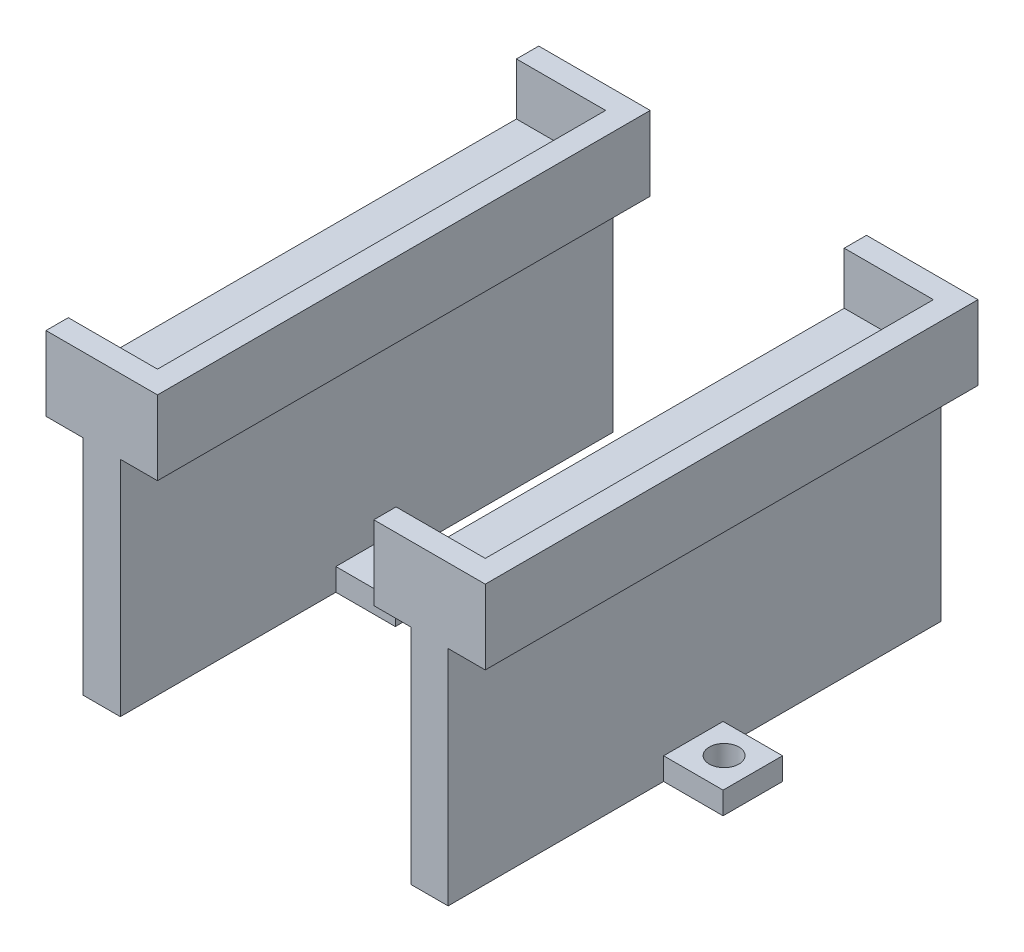
ISO-10303-21;
HEADER;
FILE_DESCRIPTION(('STEP AP214'),'2;1');
FILE_NAME('part.step','',(''),(''),'','','');
FILE_SCHEMA(('AUTOMOTIVE_DESIGN { 1 0 10303 214 1 1 1 1 }'));
ENDSEC;
DATA;
#1=APPLICATION_CONTEXT('core data for automotive mechanical design processes');
#2=APPLICATION_PROTOCOL_DEFINITION('international standard','automotive_design',2000,#1);
#3=PRODUCT_CONTEXT('',#1,'mechanical');
#4=PRODUCT('Part','Part','',(#3));
#5=PRODUCT_RELATED_PRODUCT_CATEGORY('part','',(#4));
#6=PRODUCT_DEFINITION_FORMATION('','',#4);
#7=PRODUCT_DEFINITION_CONTEXT('part definition',#1,'design');
#8=PRODUCT_DEFINITION('design','',#6,#7);
#9=PRODUCT_DEFINITION_SHAPE('','',#8);
#10=(LENGTH_UNIT() NAMED_UNIT(*) SI_UNIT(.MILLI.,.METRE.));
#11=(NAMED_UNIT(*) PLANE_ANGLE_UNIT() SI_UNIT($,.RADIAN.));
#12=(NAMED_UNIT(*) SI_UNIT($,.STERADIAN.) SOLID_ANGLE_UNIT());
#13=UNCERTAINTY_MEASURE_WITH_UNIT(LENGTH_MEASURE(1.E-05),#10,'distance_accuracy_value','');
#14=(GEOMETRIC_REPRESENTATION_CONTEXT(3) GLOBAL_UNCERTAINTY_ASSIGNED_CONTEXT((#13)) GLOBAL_UNIT_ASSIGNED_CONTEXT((#10,
#11,#12)) REPRESENTATION_CONTEXT('',''));
#15=CARTESIAN_POINT('',(0.,0.,0.));
#16=DIRECTION('',(0.,0.,1.));
#17=DIRECTION('',(1.,0.,0.));
#18=AXIS2_PLACEMENT_3D('',#15,#16,#17);
#19=CARTESIAN_POINT('',(98.107994905193,-30.,39.1134711117816));
#20=DIRECTION('',(1.,0.,0.));
#21=DIRECTION('',(0.,0.,-1.));
#22=AXIS2_PLACEMENT_3D('',#19,#20,#21);
#23=PLANE('',#22);
#24=DIRECTION('',(0.,0.,-1.));
#25=VECTOR('',#24,1.);
#26=CARTESIAN_POINT('',(98.107994905193,0.,39.1134711117816));
#27=LINE('',#26,#25);
#28=CARTESIAN_POINT('',(98.107994905193,0.,39.1134711117816));
#29=VERTEX_POINT('',#28);
#30=CARTESIAN_POINT('',(98.107994905193,0.,-27.1865288882184));
#31=VERTEX_POINT('',#30);
#32=EDGE_CURVE('E224',#29,#31,#27,.T.);
#33=ORIENTED_EDGE('',*,*,#32,.T.);
#34=DIRECTION('',(0.,1.,0.));
#35=VECTOR('',#34,1.);
#36=CARTESIAN_POINT('',(98.107994905193,-30.,-27.1865288882184));
#37=LINE('',#36,#35);
#38=CARTESIAN_POINT('',(98.107994905193,-30.,-27.1865288882184));
#39=VERTEX_POINT('',#38);
#40=EDGE_CURVE('E219',#39,#31,#37,.T.);
#41=ORIENTED_EDGE('',*,*,#40,.F.);
#42=DIRECTION('',(0.,0.,-1.));
#43=VECTOR('',#42,1.);
#44=CARTESIAN_POINT('',(98.107994905193,-30.,39.1134711117816));
#45=LINE('',#44,#43);
#46=CARTESIAN_POINT('',(98.107994905193,-30.,39.1134711117816));
#47=VERTEX_POINT('',#46);
#48=EDGE_CURVE('E233',#47,#39,#45,.T.);
#49=ORIENTED_EDGE('',*,*,#48,.F.);
#50=DIRECTION('',(0.,1.,0.));
#51=VECTOR('',#50,1.);
#52=CARTESIAN_POINT('',(98.107994905193,-30.,39.1134711117816));
#53=LINE('',#52,#51);
#54=EDGE_CURVE('E216',#47,#29,#53,.T.);
#55=ORIENTED_EDGE('',*,*,#54,.T.);
#56=EDGE_LOOP('',(#33,#41,#49,#55));
#57=FACE_BOUND('',#56,.T.);
#58=ADVANCED_FACE('F48',(#57),#23,.F.);
#59=CARTESIAN_POINT('',(44.104133085914,-30.,0.));
#60=DIRECTION('',(0.,-1.,0.));
#61=DIRECTION('',(0.,0.,-1.));
#62=AXIS2_PLACEMENT_3D('',#59,#60,#61);
#63=PLANE('',#62);
#64=DIRECTION('',(0.,0.,1.));
#65=VECTOR('',#64,1.);
#66=CARTESIAN_POINT('',(103.107994905193,-30.,39.1134711117816));
#67=LINE('',#66,#65);
#68=CARTESIAN_POINT('',(103.107994905193,-30.,-27.1865288882184));
#69=VERTEX_POINT('',#68);
#70=CARTESIAN_POINT('',(103.107994905193,-30.,2.11347111178159));
#71=VERTEX_POINT('',#70);
#72=EDGE_CURVE('E228',#69,#71,#67,.T.);
#73=ORIENTED_EDGE('',*,*,#72,.T.);
#74=DIRECTION('',(1.,0.,0.));
#75=VECTOR('',#74,1.);
#76=CARTESIAN_POINT('',(111.107994905193,-30.,2.11347111178159));
#77=LINE('',#76,#75);
#78=CARTESIAN_POINT('',(111.107994905193,-30.,2.11347111178159));
#79=VERTEX_POINT('',#78);
#80=EDGE_CURVE('E176',#71,#79,#77,.T.);
#81=ORIENTED_EDGE('',*,*,#80,.T.);
#82=DIRECTION('',(0.,0.,1.));
#83=VECTOR('',#82,1.);
#84=CARTESIAN_POINT('',(111.107994905193,-30.,2.11347111178159));
#85=LINE('',#84,#83);
#86=CARTESIAN_POINT('',(111.107994905193,-30.,10.1134711117816));
#87=VERTEX_POINT('',#86);
#88=EDGE_CURVE('E163',#79,#87,#85,.T.);
#89=ORIENTED_EDGE('',*,*,#88,.T.);
#90=DIRECTION('',(-1.,0.,0.));
#91=VECTOR('',#90,1.);
#92=CARTESIAN_POINT('',(111.107994905193,-30.,10.1134711117816));
#93=LINE('',#92,#91);
#94=CARTESIAN_POINT('',(103.107994905193,-30.,10.1134711117816));
#95=VERTEX_POINT('',#94);
#96=EDGE_CURVE('E63',#87,#95,#93,.T.);
#97=ORIENTED_EDGE('',*,*,#96,.T.);
#98=CARTESIAN_POINT('',(103.107994905193,-30.,39.1134711117816));
#99=VERTEX_POINT('',#98);
#100=EDGE_CURVE('E237',#95,#99,#67,.T.);
#101=ORIENTED_EDGE('',*,*,#100,.T.);
#102=DIRECTION('',(-1.,0.,0.));
#103=VECTOR('',#102,1.);
#104=CARTESIAN_POINT('',(98.107994905193,-30.,39.1134711117816));
#105=LINE('',#104,#103);
#106=EDGE_CURVE('E235',#99,#47,#105,.T.);
#107=ORIENTED_EDGE('',*,*,#106,.T.);
#108=ORIENTED_EDGE('',*,*,#48,.T.);
#109=DIRECTION('',(1.,0.,0.));
#110=VECTOR('',#109,1.);
#111=CARTESIAN_POINT('',(98.107994905193,-30.,-27.1865288882184));
#112=LINE('',#111,#110);
#113=EDGE_CURVE('E223',#39,#69,#112,.T.);
#114=ORIENTED_EDGE('',*,*,#113,.T.);
#115=EDGE_LOOP('',(#73,#81,#89,#97,#101,#107,#108,#114));
#116=FACE_BOUND('',#115,.T.);
#117=CARTESIAN_POINT('',(107.150165762411,-30.,6.02116583114644));
#118=DIRECTION('',(0.,-1.,0.));
#119=DIRECTION('',(0.,0.,-1.));
#120=AXIS2_PLACEMENT_3D('',#117,#118,#119);
#121=CIRCLE('',#120,1.99416254043105);
#122=CARTESIAN_POINT('',(107.150165762411,-30.,4.02700329071538));
#123=VERTEX_POINT('',#122);
#124=EDGE_CURVE('E196',#123,#123,#121,.T.);
#125=ORIENTED_EDGE('',*,*,#124,.F.);
#126=EDGE_LOOP('',(#125));
#127=FACE_BOUND('',#126,.T.);
#128=ADVANCED_FACE('F174',(#116,#127),#63,.T.);
#129=CARTESIAN_POINT('',(103.107994905193,-30.,39.1134711117816));
#130=DIRECTION('',(-1.,0.,0.));
#131=DIRECTION('',(0.,0.,1.));
#132=AXIS2_PLACEMENT_3D('',#129,#130,#131);
#133=PLANE('',#132);
#134=ORIENTED_EDGE('',*,*,#100,.F.);
#135=DIRECTION('',(0.,-1.,0.));
#136=VECTOR('',#135,1.);
#137=CARTESIAN_POINT('',(103.107994905193,-27.,10.1134711117816));
#138=LINE('',#137,#136);
#139=CARTESIAN_POINT('',(103.107994905193,-27.,10.1134711117816));
#140=VERTEX_POINT('',#139);
#141=EDGE_CURVE('E171',#140,#95,#138,.T.);
#142=ORIENTED_EDGE('',*,*,#141,.F.);
#143=DIRECTION('',(0.,0.,-1.));
#144=VECTOR('',#143,1.);
#145=CARTESIAN_POINT('',(103.107994905193,-27.,2.11347111178159));
#146=LINE('',#145,#144);
#147=CARTESIAN_POINT('',(103.107994905193,-27.,2.11347111178159));
#148=VERTEX_POINT('',#147);
#149=EDGE_CURVE('E181',#140,#148,#146,.T.);
#150=ORIENTED_EDGE('',*,*,#149,.T.);
#151=DIRECTION('',(0.,-1.,0.));
#152=VECTOR('',#151,1.);
#153=CARTESIAN_POINT('',(103.107994905193,-27.,2.11347111178159));
#154=LINE('',#153,#152);
#155=EDGE_CURVE('E192',#148,#71,#154,.T.);
#156=ORIENTED_EDGE('',*,*,#155,.T.);
#157=ORIENTED_EDGE('',*,*,#72,.F.);
#158=DIRECTION('',(0.,1.,0.));
#159=VECTOR('',#158,1.);
#160=CARTESIAN_POINT('',(103.107994905193,-30.,-27.1865288882184));
#161=LINE('',#160,#159);
#162=CARTESIAN_POINT('',(103.107994905193,0.,-27.1865288882184));
#163=VERTEX_POINT('',#162);
#164=EDGE_CURVE('E221',#69,#163,#161,.T.);
#165=ORIENTED_EDGE('',*,*,#164,.T.);
#166=DIRECTION('',(0.,0.,1.));
#167=VECTOR('',#166,1.);
#168=CARTESIAN_POINT('',(103.107994905193,0.,39.1134711117816));
#169=LINE('',#168,#167);
#170=CARTESIAN_POINT('',(103.107994905193,0.,39.1134711117816));
#171=VERTEX_POINT('',#170);
#172=EDGE_CURVE('E227',#163,#171,#169,.T.);
#173=ORIENTED_EDGE('',*,*,#172,.T.);
#174=DIRECTION('',(0.,1.,0.));
#175=VECTOR('',#174,1.);
#176=CARTESIAN_POINT('',(103.107994905193,-30.,39.1134711117816));
#177=LINE('',#176,#175);
#178=EDGE_CURVE('E214',#99,#171,#177,.T.);
#179=ORIENTED_EDGE('',*,*,#178,.F.);
#180=EDGE_LOOP('',(#134,#142,#150,#156,#157,#165,#173,#179));
#181=FACE_BOUND('',#180,.T.);
#182=ADVANCED_FACE('F324',(#181),#133,.F.);
#183=CARTESIAN_POINT('',(44.104133085914,0.,0.));
#184=DIRECTION('',(0.,1.,0.));
#185=DIRECTION('',(0.,0.,1.));
#186=AXIS2_PLACEMENT_3D('',#183,#184,#185);
#187=PLANE('',#186);
#188=ORIENTED_EDGE('',*,*,#172,.F.);
#189=DIRECTION('',(-1.,0.,0.));
#190=VECTOR('',#189,1.);
#191=CARTESIAN_POINT('',(108.107994905193,0.,-27.1865288882184));
#192=LINE('',#191,#190);
#193=CARTESIAN_POINT('',(108.107994905193,0.,-27.1865288882184));
#194=VERTEX_POINT('',#193);
#195=EDGE_CURVE('E255',#194,#163,#192,.T.);
#196=ORIENTED_EDGE('',*,*,#195,.F.);
#197=DIRECTION('',(0.,0.,-1.));
#198=VECTOR('',#197,1.);
#199=CARTESIAN_POINT('',(108.107994905193,0.,39.1134711117816));
#200=LINE('',#199,#198);
#201=CARTESIAN_POINT('',(108.107994905193,0.,39.1134711117816));
#202=VERTEX_POINT('',#201);
#203=EDGE_CURVE('E263',#202,#194,#200,.T.);
#204=ORIENTED_EDGE('',*,*,#203,.F.);
#205=DIRECTION('',(1.,0.,0.));
#206=VECTOR('',#205,1.);
#207=CARTESIAN_POINT('',(108.107994905193,0.,39.1134711117816));
#208=LINE('',#207,#206);
#209=EDGE_CURVE('E251',#171,#202,#208,.T.);
#210=ORIENTED_EDGE('',*,*,#209,.F.);
#211=EDGE_LOOP('',(#188,#196,#204,#210));
#212=FACE_BOUND('',#211,.T.);
#213=ADVANCED_FACE('F330',(#212),#187,.F.);
#214=CARTESIAN_POINT('',(108.107994905193,10.,39.1134711117816));
#215=DIRECTION('',(-1.,0.,0.));
#216=DIRECTION('',(0.,0.,1.));
#217=AXIS2_PLACEMENT_3D('',#214,#215,#216);
#218=PLANE('',#217);
#219=ORIENTED_EDGE('',*,*,#203,.T.);
#220=DIRECTION('',(0.,-1.,0.));
#221=VECTOR('',#220,1.);
#222=CARTESIAN_POINT('',(108.107994905193,10.,-27.1865288882184));
#223=LINE('',#222,#221);
#224=CARTESIAN_POINT('',(108.107994905193,10.,-27.1865288882184));
#225=VERTEX_POINT('',#224);
#226=EDGE_CURVE('E260',#225,#194,#223,.T.);
#227=ORIENTED_EDGE('',*,*,#226,.F.);
#228=DIRECTION('',(0.,0.,-1.));
#229=VECTOR('',#228,1.);
#230=CARTESIAN_POINT('',(108.107994905193,10.,39.1134711117816));
#231=LINE('',#230,#229);
#232=CARTESIAN_POINT('',(108.107994905193,10.,39.1134711117816));
#233=VERTEX_POINT('',#232);
#234=EDGE_CURVE('E254',#233,#225,#231,.T.);
#235=ORIENTED_EDGE('',*,*,#234,.F.);
#236=DIRECTION('',(0.,-1.,0.));
#237=VECTOR('',#236,1.);
#238=CARTESIAN_POINT('',(108.107994905193,10.,39.1134711117816));
#239=LINE('',#238,#237);
#240=EDGE_CURVE('E270',#233,#202,#239,.T.);
#241=ORIENTED_EDGE('',*,*,#240,.T.);
#242=EDGE_LOOP('',(#219,#227,#235,#241));
#243=FACE_BOUND('',#242,.T.);
#244=ADVANCED_FACE('F333',(#243),#218,.F.);
#245=CARTESIAN_POINT('',(105.107994905193,10.000012,36.1134711117816));
#246=DIRECTION('',(-1.,0.,0.));
#247=DIRECTION('',(0.,0.,1.));
#248=AXIS2_PLACEMENT_3D('',#245,#246,#247);
#249=PLANE('',#248);
#250=DIRECTION('',(0.,-1.,0.));
#251=VECTOR('',#250,1.);
#252=CARTESIAN_POINT('',(105.107994905193,10.000012,-24.1865288882183));
#253=LINE('',#252,#251);
#254=CARTESIAN_POINT('',(105.107994905193,10.,-24.1865288882183));
#255=VERTEX_POINT('',#254);
#256=CARTESIAN_POINT('',(105.107994905193,3.,-24.1865288882183));
#257=VERTEX_POINT('',#256);
#258=EDGE_CURVE('E246',#255,#257,#253,.T.);
#259=ORIENTED_EDGE('',*,*,#258,.T.);
#260=DIRECTION('',(0.,0.,-1.));
#261=VECTOR('',#260,1.);
#262=CARTESIAN_POINT('',(105.107994905193,3.,36.1134711117816));
#263=LINE('',#262,#261);
#264=CARTESIAN_POINT('',(105.107994905193,3.,36.1134711117816));
#265=VERTEX_POINT('',#264);
#266=EDGE_CURVE('E240',#265,#257,#263,.T.);
#267=ORIENTED_EDGE('',*,*,#266,.F.);
#268=DIRECTION('',(0.,-1.,0.));
#269=VECTOR('',#268,1.);
#270=CARTESIAN_POINT('',(105.107994905193,10.000012,36.1134711117816));
#271=LINE('',#270,#269);
#272=CARTESIAN_POINT('',(105.107994905193,10.,36.1134711117816));
#273=VERTEX_POINT('',#272);
#274=EDGE_CURVE('E248',#273,#265,#271,.T.);
#275=ORIENTED_EDGE('',*,*,#274,.F.);
#276=DIRECTION('',(0.,0.,1.));
#277=VECTOR('',#276,1.);
#278=CARTESIAN_POINT('',(105.107994905193,10.,0.));
#279=LINE('',#278,#277);
#280=EDGE_CURVE('E275',#255,#273,#279,.T.);
#281=ORIENTED_EDGE('',*,*,#280,.F.);
#282=EDGE_LOOP('',(#259,#267,#275,#281));
#283=FACE_BOUND('',#282,.T.);
#284=ADVANCED_FACE('F289',(#283),#249,.T.);
#285=CARTESIAN_POINT('',(44.104133085914,3.,0.));
#286=DIRECTION('',(0.,1.,0.));
#287=DIRECTION('',(0.,0.,1.));
#288=AXIS2_PLACEMENT_3D('',#285,#286,#287);
#289=PLANE('',#288);
#290=DIRECTION('',(0.,0.,-1.));
#291=VECTOR('',#290,1.);
#292=CARTESIAN_POINT('',(93.107994905193,3.,0.));
#293=LINE('',#292,#291);
#294=CARTESIAN_POINT('',(93.107994905193,3.,36.1134711117816));
#295=VERTEX_POINT('',#294);
#296=CARTESIAN_POINT('',(93.107994905193,3.,-24.1865288882183));
#297=VERTEX_POINT('',#296);
#298=EDGE_CURVE('E12',#295,#297,#293,.T.);
#299=ORIENTED_EDGE('',*,*,#298,.F.);
#300=DIRECTION('',(1.,0.,0.));
#301=VECTOR('',#300,1.);
#302=CARTESIAN_POINT('',(105.107994905193,3.,36.1134711117816));
#303=LINE('',#302,#301);
#304=EDGE_CURVE('E231',#295,#265,#303,.T.);
#305=ORIENTED_EDGE('',*,*,#304,.T.);
#306=ORIENTED_EDGE('',*,*,#266,.T.);
#307=DIRECTION('',(-1.,0.,0.));
#308=VECTOR('',#307,1.);
#309=CARTESIAN_POINT('',(105.107994905193,3.,-24.1865288882183));
#310=LINE('',#309,#308);
#311=EDGE_CURVE('E243',#257,#297,#310,.T.);
#312=ORIENTED_EDGE('',*,*,#311,.T.);
#313=EDGE_LOOP('',(#299,#305,#306,#312));
#314=FACE_BOUND('',#313,.T.);
#315=ADVANCED_FACE('F293',(#314),#289,.T.);
#316=CARTESIAN_POINT('',(105.107994905193,10.000012,-24.1865288882183));
#317=DIRECTION('',(0.,0.,1.));
#318=DIRECTION('',(1.,0.,0.));
#319=AXIS2_PLACEMENT_3D('',#316,#317,#318);
#320=PLANE('',#319);
#321=DIRECTION('',(0.,1.,0.));
#322=VECTOR('',#321,1.);
#323=CARTESIAN_POINT('',(93.107994905193,10.000012,-24.1865288882183));
#324=LINE('',#323,#322);
#325=CARTESIAN_POINT('',(93.107994905193,10.,-24.1865288882183));
#326=VERTEX_POINT('',#325);
#327=EDGE_CURVE('E207',#297,#326,#324,.T.);
#328=ORIENTED_EDGE('',*,*,#327,.F.);
#329=ORIENTED_EDGE('',*,*,#311,.F.);
#330=ORIENTED_EDGE('',*,*,#258,.F.);
#331=DIRECTION('',(1.,0.,0.));
#332=VECTOR('',#331,1.);
#333=CARTESIAN_POINT('',(44.104133085914,10.,-24.1865288882183));
#334=LINE('',#333,#332);
#335=EDGE_CURVE('E273',#326,#255,#334,.T.);
#336=ORIENTED_EDGE('',*,*,#335,.F.);
#337=EDGE_LOOP('',(#328,#329,#330,#336));
#338=FACE_BOUND('',#337,.T.);
#339=ADVANCED_FACE('F296',(#338),#320,.T.);
#340=CARTESIAN_POINT('',(105.107994905193,10.000012,36.1134711117816));
#341=DIRECTION('',(0.,0.,-1.));
#342=DIRECTION('',(-1.,0.,0.));
#343=AXIS2_PLACEMENT_3D('',#340,#341,#342);
#344=PLANE('',#343);
#345=DIRECTION('',(0.,-1.,0.));
#346=VECTOR('',#345,1.);
#347=CARTESIAN_POINT('',(93.107994905193,10.000012,36.1134711117816));
#348=LINE('',#347,#346);
#349=CARTESIAN_POINT('',(93.107994905193,10.,36.1134711117816));
#350=VERTEX_POINT('',#349);
#351=EDGE_CURVE('E70',#350,#295,#348,.T.);
#352=ORIENTED_EDGE('',*,*,#351,.F.);
#353=DIRECTION('',(-1.,0.,0.));
#354=VECTOR('',#353,1.);
#355=CARTESIAN_POINT('',(44.104133085914,10.,36.1134711117816));
#356=LINE('',#355,#354);
#357=EDGE_CURVE('E56',#273,#350,#356,.T.);
#358=ORIENTED_EDGE('',*,*,#357,.F.);
#359=ORIENTED_EDGE('',*,*,#274,.T.);
#360=ORIENTED_EDGE('',*,*,#304,.F.);
#361=EDGE_LOOP('',(#352,#358,#359,#360));
#362=FACE_BOUND('',#361,.T.);
#363=ADVANCED_FACE('F285',(#362),#344,.T.);
#364=CARTESIAN_POINT('',(108.107994905193,10.,-27.1865288882184));
#365=DIRECTION('',(0.,0.,1.));
#366=DIRECTION('',(1.,0.,0.));
#367=AXIS2_PLACEMENT_3D('',#364,#365,#366);
#368=PLANE('',#367);
#369=CARTESIAN_POINT('',(93.107994905193,0.,-27.1865288882184));
#370=VERTEX_POINT('',#369);
#371=EDGE_CURVE('E265',#31,#370,#192,.T.);
#372=ORIENTED_EDGE('',*,*,#371,.T.);
#373=DIRECTION('',(0.,-1.,0.));
#374=VECTOR('',#373,1.);
#375=CARTESIAN_POINT('',(93.107994905193,30.,-27.1865288882184));
#376=LINE('',#375,#374);
#377=CARTESIAN_POINT('',(93.107994905193,10.,-27.1865288882184));
#378=VERTEX_POINT('',#377);
#379=EDGE_CURVE('E203',#378,#370,#376,.T.);
#380=ORIENTED_EDGE('',*,*,#379,.F.);
#381=DIRECTION('',(-1.,0.,0.));
#382=VECTOR('',#381,1.);
#383=CARTESIAN_POINT('',(108.107994905193,10.,-27.1865288882184));
#384=LINE('',#383,#382);
#385=EDGE_CURVE('E257',#225,#378,#384,.T.);
#386=ORIENTED_EDGE('',*,*,#385,.F.);
#387=ORIENTED_EDGE('',*,*,#226,.T.);
#388=ORIENTED_EDGE('',*,*,#195,.T.);
#389=ORIENTED_EDGE('',*,*,#164,.F.);
#390=ORIENTED_EDGE('',*,*,#113,.F.);
#391=ORIENTED_EDGE('',*,*,#40,.T.);
#392=EDGE_LOOP('',(#372,#380,#386,#387,#388,#389,#390,#391));
#393=FACE_BOUND('',#392,.T.);
#394=ADVANCED_FACE('F306',(#393),#368,.F.);
#395=CARTESIAN_POINT('',(108.107994905193,10.,39.1134711117816));
#396=DIRECTION('',(0.,0.,-1.));
#397=DIRECTION('',(-1.,0.,0.));
#398=AXIS2_PLACEMENT_3D('',#395,#396,#397);
#399=PLANE('',#398);
#400=DIRECTION('',(1.,0.,0.));
#401=VECTOR('',#400,1.);
#402=CARTESIAN_POINT('',(108.107994905193,10.,39.1134711117816));
#403=LINE('',#402,#401);
#404=CARTESIAN_POINT('',(93.107994905193,10.,39.1134711117816));
#405=VERTEX_POINT('',#404);
#406=EDGE_CURVE('E252',#405,#233,#403,.T.);
#407=ORIENTED_EDGE('',*,*,#406,.F.);
#408=DIRECTION('',(0.,-1.,0.));
#409=VECTOR('',#408,1.);
#410=CARTESIAN_POINT('',(93.107994905193,30.,39.1134711117816));
#411=LINE('',#410,#409);
#412=CARTESIAN_POINT('',(93.107994905193,0.,39.1134711117816));
#413=VERTEX_POINT('',#412);
#414=EDGE_CURVE('E204',#405,#413,#411,.T.);
#415=ORIENTED_EDGE('',*,*,#414,.T.);
#416=EDGE_CURVE('E261',#413,#29,#208,.T.);
#417=ORIENTED_EDGE('',*,*,#416,.T.);
#418=ORIENTED_EDGE('',*,*,#54,.F.);
#419=ORIENTED_EDGE('',*,*,#106,.F.);
#420=ORIENTED_EDGE('',*,*,#178,.T.);
#421=ORIENTED_EDGE('',*,*,#209,.T.);
#422=ORIENTED_EDGE('',*,*,#240,.F.);
#423=EDGE_LOOP('',(#407,#415,#417,#418,#419,#420,#421,#422));
#424=FACE_BOUND('',#423,.T.);
#425=ADVANCED_FACE('F50',(#424),#399,.F.);
#426=CARTESIAN_POINT('',(44.104133085914,10.,0.));
#427=DIRECTION('',(0.,1.,0.));
#428=DIRECTION('',(0.,0.,1.));
#429=AXIS2_PLACEMENT_3D('',#426,#427,#428);
#430=PLANE('',#429);
#431=DIRECTION('',(0.,0.,-1.));
#432=VECTOR('',#431,1.);
#433=CARTESIAN_POINT('',(93.107994905193,10.,0.));
#434=LINE('',#433,#432);
#435=EDGE_CURVE('E213',#405,#350,#434,.T.);
#436=ORIENTED_EDGE('',*,*,#435,.F.);
#437=ORIENTED_EDGE('',*,*,#406,.T.);
#438=ORIENTED_EDGE('',*,*,#234,.T.);
#439=ORIENTED_EDGE('',*,*,#385,.T.);
#440=EDGE_CURVE('E211',#326,#378,#434,.T.);
#441=ORIENTED_EDGE('',*,*,#440,.F.);
#442=ORIENTED_EDGE('',*,*,#335,.T.);
#443=ORIENTED_EDGE('',*,*,#280,.T.);
#444=ORIENTED_EDGE('',*,*,#357,.T.);
#445=EDGE_LOOP('',(#436,#437,#438,#439,#441,#442,#443,#444));
#446=FACE_BOUND('',#445,.T.);
#447=ADVANCED_FACE('F280',(#446),#430,.T.);
#448=ORIENTED_EDGE('',*,*,#416,.F.);
#449=DIRECTION('',(0.,0.,1.));
#450=VECTOR('',#449,1.);
#451=CARTESIAN_POINT('',(93.107994905193,0.,-27.1865288882184));
#452=LINE('',#451,#450);
#453=EDGE_CURVE('E199',#370,#413,#452,.T.);
#454=ORIENTED_EDGE('',*,*,#453,.F.);
#455=ORIENTED_EDGE('',*,*,#371,.F.);
#456=ORIENTED_EDGE('',*,*,#32,.F.);
#457=EDGE_LOOP('',(#448,#454,#455,#456));
#458=FACE_BOUND('',#457,.T.);
#459=ADVANCED_FACE('F312',(#458),#187,.F.);
#460=CARTESIAN_POINT('',(93.107994905193,30.,-27.1865288882184));
#461=DIRECTION('',(1.,0.,0.));
#462=DIRECTION('',(0.,0.,-1.));
#463=AXIS2_PLACEMENT_3D('',#460,#461,#462);
#464=PLANE('',#463);
#465=ORIENTED_EDGE('',*,*,#435,.T.);
#466=ORIENTED_EDGE('',*,*,#351,.T.);
#467=ORIENTED_EDGE('',*,*,#298,.T.);
#468=ORIENTED_EDGE('',*,*,#327,.T.);
#469=ORIENTED_EDGE('',*,*,#440,.T.);
#470=ORIENTED_EDGE('',*,*,#379,.T.);
#471=ORIENTED_EDGE('',*,*,#453,.T.);
#472=ORIENTED_EDGE('',*,*,#414,.F.);
#473=EDGE_LOOP('',(#465,#466,#467,#468,#469,#470,#471,#472));
#474=FACE_BOUND('',#473,.T.);
#475=ADVANCED_FACE('F299',(#474),#464,.F.);
#476=CARTESIAN_POINT('',(111.107994905193,-27.,10.1134711117816));
#477=DIRECTION('',(0.,0.,1.));
#478=DIRECTION('',(1.,0.,0.));
#479=AXIS2_PLACEMENT_3D('',#476,#477,#478);
#480=PLANE('',#479);
#481=ORIENTED_EDGE('',*,*,#96,.F.);
#482=DIRECTION('',(0.,-1.,0.));
#483=VECTOR('',#482,1.);
#484=CARTESIAN_POINT('',(111.107994905193,-27.,10.1134711117816));
#485=LINE('',#484,#483);
#486=CARTESIAN_POINT('',(111.107994905193,-27.,10.1134711117816));
#487=VERTEX_POINT('',#486);
#488=EDGE_CURVE('E161',#487,#87,#485,.T.);
#489=ORIENTED_EDGE('',*,*,#488,.F.);
#490=DIRECTION('',(-1.,0.,0.));
#491=VECTOR('',#490,1.);
#492=CARTESIAN_POINT('',(111.107994905193,-27.,10.1134711117816));
#493=LINE('',#492,#491);
#494=EDGE_CURVE('E190',#487,#140,#493,.T.);
#495=ORIENTED_EDGE('',*,*,#494,.T.);
#496=ORIENTED_EDGE('',*,*,#141,.T.);
#497=EDGE_LOOP('',(#481,#489,#495,#496));
#498=FACE_BOUND('',#497,.T.);
#499=ADVANCED_FACE('F178',(#498),#480,.T.);
#500=CARTESIAN_POINT('',(111.107994905193,-27.,2.11347111178159));
#501=DIRECTION('',(1.,0.,0.));
#502=DIRECTION('',(0.,0.,-1.));
#503=AXIS2_PLACEMENT_3D('',#500,#501,#502);
#504=PLANE('',#503);
#505=ORIENTED_EDGE('',*,*,#88,.F.);
#506=DIRECTION('',(0.,-1.,0.));
#507=VECTOR('',#506,1.);
#508=CARTESIAN_POINT('',(111.107994905193,-27.,2.11347111178159));
#509=LINE('',#508,#507);
#510=CARTESIAN_POINT('',(111.107994905193,-27.,2.11347111178159));
#511=VERTEX_POINT('',#510);
#512=EDGE_CURVE('E170',#511,#79,#509,.T.);
#513=ORIENTED_EDGE('',*,*,#512,.F.);
#514=DIRECTION('',(0.,0.,1.));
#515=VECTOR('',#514,1.);
#516=CARTESIAN_POINT('',(111.107994905193,-27.,2.11347111178159));
#517=LINE('',#516,#515);
#518=EDGE_CURVE('E166',#511,#487,#517,.T.);
#519=ORIENTED_EDGE('',*,*,#518,.T.);
#520=ORIENTED_EDGE('',*,*,#488,.T.);
#521=EDGE_LOOP('',(#505,#513,#519,#520));
#522=FACE_BOUND('',#521,.T.);
#523=ADVANCED_FACE('F162',(#522),#504,.T.);
#524=CARTESIAN_POINT('',(111.107994905193,-27.,2.11347111178159));
#525=DIRECTION('',(0.,0.,-1.));
#526=DIRECTION('',(-1.,0.,0.));
#527=AXIS2_PLACEMENT_3D('',#524,#525,#526);
#528=PLANE('',#527);
#529=ORIENTED_EDGE('',*,*,#80,.F.);
#530=ORIENTED_EDGE('',*,*,#155,.F.);
#531=DIRECTION('',(1.,0.,0.));
#532=VECTOR('',#531,1.);
#533=CARTESIAN_POINT('',(111.107994905193,-27.,2.11347111178159));
#534=LINE('',#533,#532);
#535=EDGE_CURVE('E184',#148,#511,#534,.T.);
#536=ORIENTED_EDGE('',*,*,#535,.T.);
#537=ORIENTED_EDGE('',*,*,#512,.T.);
#538=EDGE_LOOP('',(#529,#530,#536,#537));
#539=FACE_BOUND('',#538,.T.);
#540=ADVANCED_FACE('F395',(#539),#528,.T.);
#541=CARTESIAN_POINT('',(44.104133085914,-27.,0.));
#542=DIRECTION('',(0.,-1.,0.));
#543=DIRECTION('',(0.,0.,-1.));
#544=AXIS2_PLACEMENT_3D('',#541,#542,#543);
#545=PLANE('',#544);
#546=CARTESIAN_POINT('',(107.150165762411,-27.,6.02116583114644));
#547=DIRECTION('',(0.,-1.,0.));
#548=DIRECTION('',(0.,0.,-1.));
#549=AXIS2_PLACEMENT_3D('',#546,#547,#548);
#550=CIRCLE('',#549,1.99416254043105);
#551=CARTESIAN_POINT('',(107.150165762411,-27.,4.02700329071538));
#552=VERTEX_POINT('',#551);
#553=EDGE_CURVE('E189',#552,#552,#550,.T.);
#554=ORIENTED_EDGE('',*,*,#553,.T.);
#555=EDGE_LOOP('',(#554));
#556=FACE_BOUND('',#555,.T.);
#557=ORIENTED_EDGE('',*,*,#149,.F.);
#558=ORIENTED_EDGE('',*,*,#494,.F.);
#559=ORIENTED_EDGE('',*,*,#518,.F.);
#560=ORIENTED_EDGE('',*,*,#535,.F.);
#561=EDGE_LOOP('',(#557,#558,#559,#560));
#562=FACE_BOUND('',#561,.T.);
#563=ADVANCED_FACE('F403',(#556,#562),#545,.F.);
#564=CARTESIAN_POINT('',(107.150165762411,-27.,6.02116583114644));
#565=DIRECTION('',(0.,-1.,0.));
#566=DIRECTION('',(0.,0.,-1.));
#567=AXIS2_PLACEMENT_3D('',#564,#565,#566);
#568=CYLINDRICAL_SURFACE('',#567,1.99416254043105);
#569=ORIENTED_EDGE('',*,*,#553,.F.);
#570=EDGE_LOOP('',(#569));
#571=FACE_BOUND('',#570,.T.);
#572=ORIENTED_EDGE('',*,*,#124,.T.);
#573=EDGE_LOOP('',(#572));
#574=FACE_BOUND('',#573,.T.);
#575=ADVANCED_FACE('F412',(#571,#574),#568,.F.);
#576=CLOSED_SHELL('',(#58,#128,#182,#213,#244,#284,#315,#339,#363,#394,#425,#447,#459,#475,#499,
#523,#540,#563,#575));
#577=MANIFOLD_SOLID_BREP('B2',#576);
#578=CARTESIAN_POINT('',(54.003861819279,-30.,39.1134711117816));
#579=DIRECTION('',(1.,0.,0.));
#580=DIRECTION('',(0.,0.,-1.));
#581=AXIS2_PLACEMENT_3D('',#578,#579,#580);
#582=PLANE('',#581);
#583=DIRECTION('',(0.,0.,-1.));
#584=VECTOR('',#583,1.);
#585=CARTESIAN_POINT('',(54.003861819279,0.,39.1134711117816));
#586=LINE('',#585,#584);
#587=CARTESIAN_POINT('',(54.003861819279,0.,39.1134711117816));
#588=VERTEX_POINT('',#587);
#589=CARTESIAN_POINT('',(54.003861819279,0.,-27.1865288882184));
#590=VERTEX_POINT('',#589);
#591=EDGE_CURVE('E690',#588,#590,#586,.T.);
#592=ORIENTED_EDGE('',*,*,#591,.T.);
#593=DIRECTION('',(0.,1.,0.));
#594=VECTOR('',#593,1.);
#595=CARTESIAN_POINT('',(54.003861819279,-30.,-27.1865288882184));
#596=LINE('',#595,#594);
#597=CARTESIAN_POINT('',(54.003861819279,-30.,-27.1865288882184));
#598=VERTEX_POINT('',#597);
#599=EDGE_CURVE('E685',#598,#590,#596,.T.);
#600=ORIENTED_EDGE('',*,*,#599,.F.);
#601=DIRECTION('',(0.,0.,-1.));
#602=VECTOR('',#601,1.);
#603=CARTESIAN_POINT('',(54.003861819279,-30.,39.1134711117816));
#604=LINE('',#603,#602);
#605=CARTESIAN_POINT('',(54.003861819279,-30.,39.1134711117816));
#606=VERTEX_POINT('',#605);
#607=EDGE_CURVE('E699',#606,#598,#604,.T.);
#608=ORIENTED_EDGE('',*,*,#607,.F.);
#609=DIRECTION('',(0.,1.,0.));
#610=VECTOR('',#609,1.);
#611=CARTESIAN_POINT('',(54.003861819279,-30.,39.1134711117816));
#612=LINE('',#611,#610);
#613=EDGE_CURVE('E682',#606,#588,#612,.T.);
#614=ORIENTED_EDGE('',*,*,#613,.T.);
#615=EDGE_LOOP('',(#592,#600,#608,#614));
#616=FACE_BOUND('',#615,.T.);
#617=ADVANCED_FACE('F514',(#616),#582,.F.);
#618=CARTESIAN_POINT('',(0.,-30.,0.));
#619=DIRECTION('',(0.,-1.,0.));
#620=DIRECTION('',(0.,0.,-1.));
#621=AXIS2_PLACEMENT_3D('',#618,#619,#620);
#622=PLANE('',#621);
#623=DIRECTION('',(0.,0.,1.));
#624=VECTOR('',#623,1.);
#625=CARTESIAN_POINT('',(59.0038618192789,-30.,39.1134711117816));
#626=LINE('',#625,#624);
#627=CARTESIAN_POINT('',(59.003861819279,-30.,-27.1865288882184));
#628=VERTEX_POINT('',#627);
#629=CARTESIAN_POINT('',(59.003861819279,-30.,2.11347111178159));
#630=VERTEX_POINT('',#629);
#631=EDGE_CURVE('E694',#628,#630,#626,.T.);
#632=ORIENTED_EDGE('',*,*,#631,.T.);
#633=DIRECTION('',(1.,0.,0.));
#634=VECTOR('',#633,1.);
#635=CARTESIAN_POINT('',(67.003861819279,-30.,2.11347111178159));
#636=LINE('',#635,#634);
#637=CARTESIAN_POINT('',(67.003861819279,-30.,2.11347111178159));
#638=VERTEX_POINT('',#637);
#639=EDGE_CURVE('E642',#630,#638,#636,.T.);
#640=ORIENTED_EDGE('',*,*,#639,.T.);
#641=DIRECTION('',(0.,0.,1.));
#642=VECTOR('',#641,1.);
#643=CARTESIAN_POINT('',(67.003861819279,-30.,2.11347111178159));
#644=LINE('',#643,#642);
#645=CARTESIAN_POINT('',(67.003861819279,-30.,10.1134711117816));
#646=VERTEX_POINT('',#645);
#647=EDGE_CURVE('E629',#638,#646,#644,.T.);
#648=ORIENTED_EDGE('',*,*,#647,.T.);
#649=DIRECTION('',(-1.,0.,0.));
#650=VECTOR('',#649,1.);
#651=CARTESIAN_POINT('',(67.003861819279,-30.,10.1134711117816));
#652=LINE('',#651,#650);
#653=CARTESIAN_POINT('',(59.0038618192789,-30.,10.1134711117816));
#654=VERTEX_POINT('',#653);
#655=EDGE_CURVE('E529',#646,#654,#652,.T.);
#656=ORIENTED_EDGE('',*,*,#655,.T.);
#657=CARTESIAN_POINT('',(59.0038618192789,-30.,39.1134711117816));
#658=VERTEX_POINT('',#657);
#659=EDGE_CURVE('E703',#654,#658,#626,.T.);
#660=ORIENTED_EDGE('',*,*,#659,.T.);
#661=DIRECTION('',(-1.,0.,0.));
#662=VECTOR('',#661,1.);
#663=CARTESIAN_POINT('',(54.003861819279,-30.,39.1134711117816));
#664=LINE('',#663,#662);
#665=EDGE_CURVE('E701',#658,#606,#664,.T.);
#666=ORIENTED_EDGE('',*,*,#665,.T.);
#667=ORIENTED_EDGE('',*,*,#607,.T.);
#668=DIRECTION('',(1.,0.,0.));
#669=VECTOR('',#668,1.);
#670=CARTESIAN_POINT('',(54.003861819279,-30.,-27.1865288882184));
#671=LINE('',#670,#669);
#672=EDGE_CURVE('E689',#598,#628,#671,.T.);
#673=ORIENTED_EDGE('',*,*,#672,.T.);
#674=EDGE_LOOP('',(#632,#640,#648,#656,#660,#666,#667,#673));
#675=FACE_BOUND('',#674,.T.);
#676=CARTESIAN_POINT('',(63.0460326764973,-30.,6.02116583114644));
#677=DIRECTION('',(0.,-1.,0.));
#678=DIRECTION('',(0.,0.,-1.));
#679=AXIS2_PLACEMENT_3D('',#676,#677,#678);
#680=CIRCLE('',#679,1.99416254043105);
#681=CARTESIAN_POINT('',(63.0460326764973,-30.,4.02700329071538));
#682=VERTEX_POINT('',#681);
#683=EDGE_CURVE('E662',#682,#682,#680,.T.);
#684=ORIENTED_EDGE('',*,*,#683,.F.);
#685=EDGE_LOOP('',(#684));
#686=FACE_BOUND('',#685,.T.);
#687=ADVANCED_FACE('F640',(#675,#686),#622,.T.);
#688=CARTESIAN_POINT('',(59.0038618192789,-30.,39.1134711117816));
#689=DIRECTION('',(-1.,0.,0.));
#690=DIRECTION('',(0.,0.,1.));
#691=AXIS2_PLACEMENT_3D('',#688,#689,#690);
#692=PLANE('',#691);
#693=ORIENTED_EDGE('',*,*,#659,.F.);
#694=DIRECTION('',(0.,-1.,0.));
#695=VECTOR('',#694,1.);
#696=CARTESIAN_POINT('',(59.003861819279,-27.,10.1134711117816));
#697=LINE('',#696,#695);
#698=CARTESIAN_POINT('',(59.003861819279,-27.,10.1134711117816));
#699=VERTEX_POINT('',#698);
#700=EDGE_CURVE('E637',#699,#654,#697,.T.);
#701=ORIENTED_EDGE('',*,*,#700,.F.);
#702=DIRECTION('',(0.,0.,-1.));
#703=VECTOR('',#702,1.);
#704=CARTESIAN_POINT('',(59.003861819279,-27.,2.11347111178159));
#705=LINE('',#704,#703);
#706=CARTESIAN_POINT('',(59.003861819279,-27.,2.11347111178159));
#707=VERTEX_POINT('',#706);
#708=EDGE_CURVE('E647',#699,#707,#705,.T.);
#709=ORIENTED_EDGE('',*,*,#708,.T.);
#710=DIRECTION('',(0.,-1.,0.));
#711=VECTOR('',#710,1.);
#712=CARTESIAN_POINT('',(59.003861819279,-27.,2.11347111178159));
#713=LINE('',#712,#711);
#714=EDGE_CURVE('E658',#707,#630,#713,.T.);
#715=ORIENTED_EDGE('',*,*,#714,.T.);
#716=ORIENTED_EDGE('',*,*,#631,.F.);
#717=DIRECTION('',(0.,1.,0.));
#718=VECTOR('',#717,1.);
#719=CARTESIAN_POINT('',(59.003861819279,-30.,-27.1865288882184));
#720=LINE('',#719,#718);
#721=CARTESIAN_POINT('',(59.003861819279,0.,-27.1865288882184));
#722=VERTEX_POINT('',#721);
#723=EDGE_CURVE('E687',#628,#722,#720,.T.);
#724=ORIENTED_EDGE('',*,*,#723,.T.);
#725=DIRECTION('',(0.,0.,1.));
#726=VECTOR('',#725,1.);
#727=CARTESIAN_POINT('',(59.0038618192789,0.,39.1134711117816));
#728=LINE('',#727,#726);
#729=CARTESIAN_POINT('',(59.0038618192789,0.,39.1134711117816));
#730=VERTEX_POINT('',#729);
#731=EDGE_CURVE('E693',#722,#730,#728,.T.);
#732=ORIENTED_EDGE('',*,*,#731,.T.);
#733=DIRECTION('',(0.,1.,0.));
#734=VECTOR('',#733,1.);
#735=CARTESIAN_POINT('',(59.0038618192789,-30.,39.1134711117816));
#736=LINE('',#735,#734);
#737=EDGE_CURVE('E680',#658,#730,#736,.T.);
#738=ORIENTED_EDGE('',*,*,#737,.F.);
#739=EDGE_LOOP('',(#693,#701,#709,#715,#716,#724,#732,#738));
#740=FACE_BOUND('',#739,.T.);
#741=ADVANCED_FACE('F790',(#740),#692,.F.);
#742=CARTESIAN_POINT('',(0.,0.,0.));
#743=DIRECTION('',(0.,1.,0.));
#744=DIRECTION('',(0.,0.,1.));
#745=AXIS2_PLACEMENT_3D('',#742,#743,#744);
#746=PLANE('',#745);
#747=ORIENTED_EDGE('',*,*,#731,.F.);
#748=DIRECTION('',(-1.,0.,0.));
#749=VECTOR('',#748,1.);
#750=CARTESIAN_POINT('',(64.0038618192789,0.,-27.1865288882184));
#751=LINE('',#750,#749);
#752=CARTESIAN_POINT('',(64.0038618192789,0.,-27.1865288882184));
#753=VERTEX_POINT('',#752);
#754=EDGE_CURVE('E721',#753,#722,#751,.T.);
#755=ORIENTED_EDGE('',*,*,#754,.F.);
#756=DIRECTION('',(0.,0.,-1.));
#757=VECTOR('',#756,1.);
#758=CARTESIAN_POINT('',(64.0038618192789,0.,39.1134711117816));
#759=LINE('',#758,#757);
#760=CARTESIAN_POINT('',(64.0038618192789,0.,39.1134711117816));
#761=VERTEX_POINT('',#760);
#762=EDGE_CURVE('E729',#761,#753,#759,.T.);
#763=ORIENTED_EDGE('',*,*,#762,.F.);
#764=DIRECTION('',(1.,0.,0.));
#765=VECTOR('',#764,1.);
#766=CARTESIAN_POINT('',(64.0038618192789,0.,39.1134711117816));
#767=LINE('',#766,#765);
#768=EDGE_CURVE('E717',#730,#761,#767,.T.);
#769=ORIENTED_EDGE('',*,*,#768,.F.);
#770=EDGE_LOOP('',(#747,#755,#763,#769));
#771=FACE_BOUND('',#770,.T.);
#772=ADVANCED_FACE('F796',(#771),#746,.F.);
#773=CARTESIAN_POINT('',(64.0038618192789,10.,39.1134711117816));
#774=DIRECTION('',(-1.,0.,0.));
#775=DIRECTION('',(0.,0.,1.));
#776=AXIS2_PLACEMENT_3D('',#773,#774,#775);
#777=PLANE('',#776);
#778=ORIENTED_EDGE('',*,*,#762,.T.);
#779=DIRECTION('',(0.,-1.,0.));
#780=VECTOR('',#779,1.);
#781=CARTESIAN_POINT('',(64.0038618192789,10.,-27.1865288882184));
#782=LINE('',#781,#780);
#783=CARTESIAN_POINT('',(64.0038618192789,10.,-27.1865288882184));
#784=VERTEX_POINT('',#783);
#785=EDGE_CURVE('E726',#784,#753,#782,.T.);
#786=ORIENTED_EDGE('',*,*,#785,.F.);
#787=DIRECTION('',(0.,0.,-1.));
#788=VECTOR('',#787,1.);
#789=CARTESIAN_POINT('',(64.0038618192789,10.,39.1134711117816));
#790=LINE('',#789,#788);
#791=CARTESIAN_POINT('',(64.0038618192789,10.,39.1134711117816));
#792=VERTEX_POINT('',#791);
#793=EDGE_CURVE('E720',#792,#784,#790,.T.);
#794=ORIENTED_EDGE('',*,*,#793,.F.);
#795=DIRECTION('',(0.,-1.,0.));
#796=VECTOR('',#795,1.);
#797=CARTESIAN_POINT('',(64.0038618192789,10.,39.1134711117816));
#798=LINE('',#797,#796);
#799=EDGE_CURVE('E736',#792,#761,#798,.T.);
#800=ORIENTED_EDGE('',*,*,#799,.T.);
#801=EDGE_LOOP('',(#778,#786,#794,#800));
#802=FACE_BOUND('',#801,.T.);
#803=ADVANCED_FACE('F799',(#802),#777,.F.);
#804=CARTESIAN_POINT('',(61.0038618192789,10.000012,36.1134711117816));
#805=DIRECTION('',(-1.,0.,0.));
#806=DIRECTION('',(0.,0.,1.));
#807=AXIS2_PLACEMENT_3D('',#804,#805,#806);
#808=PLANE('',#807);
#809=DIRECTION('',(0.,-1.,0.));
#810=VECTOR('',#809,1.);
#811=CARTESIAN_POINT('',(61.0038618192789,10.000012,-24.1865288882183));
#812=LINE('',#811,#810);
#813=CARTESIAN_POINT('',(61.0038618192789,10.,-24.1865288882183));
#814=VERTEX_POINT('',#813);
#815=CARTESIAN_POINT('',(61.0038618192789,3.,-24.1865288882183));
#816=VERTEX_POINT('',#815);
#817=EDGE_CURVE('E712',#814,#816,#812,.T.);
#818=ORIENTED_EDGE('',*,*,#817,.T.);
#819=DIRECTION('',(0.,0.,-1.));
#820=VECTOR('',#819,1.);
#821=CARTESIAN_POINT('',(61.0038618192789,3.,36.1134711117816));
#822=LINE('',#821,#820);
#823=CARTESIAN_POINT('',(61.0038618192789,3.,36.1134711117816));
#824=VERTEX_POINT('',#823);
#825=EDGE_CURVE('E706',#824,#816,#822,.T.);
#826=ORIENTED_EDGE('',*,*,#825,.F.);
#827=DIRECTION('',(0.,-1.,0.));
#828=VECTOR('',#827,1.);
#829=CARTESIAN_POINT('',(61.0038618192789,10.000012,36.1134711117816));
#830=LINE('',#829,#828);
#831=CARTESIAN_POINT('',(61.0038618192789,10.,36.1134711117816));
#832=VERTEX_POINT('',#831);
#833=EDGE_CURVE('E714',#832,#824,#830,.T.);
#834=ORIENTED_EDGE('',*,*,#833,.F.);
#835=DIRECTION('',(0.,0.,1.));
#836=VECTOR('',#835,1.);
#837=CARTESIAN_POINT('',(61.0038618192789,10.,0.));
#838=LINE('',#837,#836);
#839=EDGE_CURVE('E741',#814,#832,#838,.T.);
#840=ORIENTED_EDGE('',*,*,#839,.F.);
#841=EDGE_LOOP('',(#818,#826,#834,#840));
#842=FACE_BOUND('',#841,.T.);
#843=ADVANCED_FACE('F755',(#842),#808,.T.);
#844=CARTESIAN_POINT('',(0.,3.,0.));
#845=DIRECTION('',(0.,1.,0.));
#846=DIRECTION('',(0.,0.,1.));
#847=AXIS2_PLACEMENT_3D('',#844,#845,#846);
#848=PLANE('',#847);
#849=DIRECTION('',(0.,0.,-1.));
#850=VECTOR('',#849,1.);
#851=CARTESIAN_POINT('',(49.003861819279,3.,0.));
#852=LINE('',#851,#850);
#853=CARTESIAN_POINT('',(49.003861819279,3.,36.1134711117816));
#854=VERTEX_POINT('',#853);
#855=CARTESIAN_POINT('',(49.003861819279,3.,-24.1865288882183));
#856=VERTEX_POINT('',#855);
#857=EDGE_CURVE('E46',#854,#856,#852,.T.);
#858=ORIENTED_EDGE('',*,*,#857,.F.);
#859=DIRECTION('',(1.,0.,0.));
#860=VECTOR('',#859,1.);
#861=CARTESIAN_POINT('',(61.0038618192789,3.,36.1134711117816));
#862=LINE('',#861,#860);
#863=EDGE_CURVE('E697',#854,#824,#862,.T.);
#864=ORIENTED_EDGE('',*,*,#863,.T.);
#865=ORIENTED_EDGE('',*,*,#825,.T.);
#866=DIRECTION('',(-1.,0.,0.));
#867=VECTOR('',#866,1.);
#868=CARTESIAN_POINT('',(61.0038618192789,3.,-24.1865288882183));
#869=LINE('',#868,#867);
#870=EDGE_CURVE('E709',#816,#856,#869,.T.);
#871=ORIENTED_EDGE('',*,*,#870,.T.);
#872=EDGE_LOOP('',(#858,#864,#865,#871));
#873=FACE_BOUND('',#872,.T.);
#874=ADVANCED_FACE('F759',(#873),#848,.T.);
#875=CARTESIAN_POINT('',(61.0038618192789,10.000012,-24.1865288882183));
#876=DIRECTION('',(0.,0.,1.));
#877=DIRECTION('',(1.,0.,0.));
#878=AXIS2_PLACEMENT_3D('',#875,#876,#877);
#879=PLANE('',#878);
#880=DIRECTION('',(0.,1.,0.));
#881=VECTOR('',#880,1.);
#882=CARTESIAN_POINT('',(49.003861819279,10.000012,-24.1865288882183));
#883=LINE('',#882,#881);
#884=CARTESIAN_POINT('',(49.003861819279,10.,-24.1865288882183));
#885=VERTEX_POINT('',#884);
#886=EDGE_CURVE('E673',#856,#885,#883,.T.);
#887=ORIENTED_EDGE('',*,*,#886,.F.);
#888=ORIENTED_EDGE('',*,*,#870,.F.);
#889=ORIENTED_EDGE('',*,*,#817,.F.);
#890=DIRECTION('',(1.,0.,0.));
#891=VECTOR('',#890,1.);
#892=CARTESIAN_POINT('',(0.,10.,-24.1865288882183));
#893=LINE('',#892,#891);
#894=EDGE_CURVE('E739',#885,#814,#893,.T.);
#895=ORIENTED_EDGE('',*,*,#894,.F.);
#896=EDGE_LOOP('',(#887,#888,#889,#895));
#897=FACE_BOUND('',#896,.T.);
#898=ADVANCED_FACE('F762',(#897),#879,.T.);
#899=CARTESIAN_POINT('',(61.0038618192789,10.000012,36.1134711117816));
#900=DIRECTION('',(0.,0.,-1.));
#901=DIRECTION('',(-1.,0.,0.));
#902=AXIS2_PLACEMENT_3D('',#899,#900,#901);
#903=PLANE('',#902);
#904=DIRECTION('',(0.,-1.,0.));
#905=VECTOR('',#904,1.);
#906=CARTESIAN_POINT('',(49.003861819279,10.000012,36.1134711117816));
#907=LINE('',#906,#905);
#908=CARTESIAN_POINT('',(49.003861819279,10.,36.1134711117816));
#909=VERTEX_POINT('',#908);
#910=EDGE_CURVE('E536',#909,#854,#907,.T.);
#911=ORIENTED_EDGE('',*,*,#910,.F.);
#912=DIRECTION('',(-1.,0.,0.));
#913=VECTOR('',#912,1.);
#914=CARTESIAN_POINT('',(0.,10.,36.1134711117816));
#915=LINE('',#914,#913);
#916=EDGE_CURVE('E522',#832,#909,#915,.T.);
#917=ORIENTED_EDGE('',*,*,#916,.F.);
#918=ORIENTED_EDGE('',*,*,#833,.T.);
#919=ORIENTED_EDGE('',*,*,#863,.F.);
#920=EDGE_LOOP('',(#911,#917,#918,#919));
#921=FACE_BOUND('',#920,.T.);
#922=ADVANCED_FACE('F751',(#921),#903,.T.);
#923=CARTESIAN_POINT('',(64.0038618192789,10.,-27.1865288882184));
#924=DIRECTION('',(0.,0.,1.));
#925=DIRECTION('',(1.,0.,0.));
#926=AXIS2_PLACEMENT_3D('',#923,#924,#925);
#927=PLANE('',#926);
#928=CARTESIAN_POINT('',(49.003861819279,0.,-27.1865288882184));
#929=VERTEX_POINT('',#928);
#930=EDGE_CURVE('E731',#590,#929,#751,.T.);
#931=ORIENTED_EDGE('',*,*,#930,.T.);
#932=DIRECTION('',(0.,-1.,0.));
#933=VECTOR('',#932,1.);
#934=CARTESIAN_POINT('',(49.003861819279,30.,-27.1865288882184));
#935=LINE('',#934,#933);
#936=CARTESIAN_POINT('',(49.003861819279,10.,-27.1865288882184));
#937=VERTEX_POINT('',#936);
#938=EDGE_CURVE('E669',#937,#929,#935,.T.);
#939=ORIENTED_EDGE('',*,*,#938,.F.);
#940=DIRECTION('',(-1.,0.,0.));
#941=VECTOR('',#940,1.);
#942=CARTESIAN_POINT('',(64.0038618192789,10.,-27.1865288882184));
#943=LINE('',#942,#941);
#944=EDGE_CURVE('E723',#784,#937,#943,.T.);
#945=ORIENTED_EDGE('',*,*,#944,.F.);
#946=ORIENTED_EDGE('',*,*,#785,.T.);
#947=ORIENTED_EDGE('',*,*,#754,.T.);
#948=ORIENTED_EDGE('',*,*,#723,.F.);
#949=ORIENTED_EDGE('',*,*,#672,.F.);
#950=ORIENTED_EDGE('',*,*,#599,.T.);
#951=EDGE_LOOP('',(#931,#939,#945,#946,#947,#948,#949,#950));
#952=FACE_BOUND('',#951,.T.);
#953=ADVANCED_FACE('F772',(#952),#927,.F.);
#954=CARTESIAN_POINT('',(64.0038618192789,10.,39.1134711117816));
#955=DIRECTION('',(0.,0.,-1.));
#956=DIRECTION('',(-1.,0.,0.));
#957=AXIS2_PLACEMENT_3D('',#954,#955,#956);
#958=PLANE('',#957);
#959=DIRECTION('',(1.,0.,0.));
#960=VECTOR('',#959,1.);
#961=CARTESIAN_POINT('',(64.0038618192789,10.,39.1134711117816));
#962=LINE('',#961,#960);
#963=CARTESIAN_POINT('',(49.003861819279,10.,39.1134711117816));
#964=VERTEX_POINT('',#963);
#965=EDGE_CURVE('E718',#964,#792,#962,.T.);
#966=ORIENTED_EDGE('',*,*,#965,.F.);
#967=DIRECTION('',(0.,-1.,0.));
#968=VECTOR('',#967,1.);
#969=CARTESIAN_POINT('',(49.003861819279,30.,39.1134711117816));
#970=LINE('',#969,#968);
#971=CARTESIAN_POINT('',(49.003861819279,0.,39.1134711117816));
#972=VERTEX_POINT('',#971);
#973=EDGE_CURVE('E670',#964,#972,#970,.T.);
#974=ORIENTED_EDGE('',*,*,#973,.T.);
#975=EDGE_CURVE('E727',#972,#588,#767,.T.);
#976=ORIENTED_EDGE('',*,*,#975,.T.);
#977=ORIENTED_EDGE('',*,*,#613,.F.);
#978=ORIENTED_EDGE('',*,*,#665,.F.);
#979=ORIENTED_EDGE('',*,*,#737,.T.);
#980=ORIENTED_EDGE('',*,*,#768,.T.);
#981=ORIENTED_EDGE('',*,*,#799,.F.);
#982=EDGE_LOOP('',(#966,#974,#976,#977,#978,#979,#980,#981));
#983=FACE_BOUND('',#982,.T.);
#984=ADVANCED_FACE('F516',(#983),#958,.F.);
#985=CARTESIAN_POINT('',(0.,10.,0.));
#986=DIRECTION('',(0.,1.,0.));
#987=DIRECTION('',(0.,0.,1.));
#988=AXIS2_PLACEMENT_3D('',#985,#986,#987);
#989=PLANE('',#988);
#990=DIRECTION('',(0.,0.,-1.));
#991=VECTOR('',#990,1.);
#992=CARTESIAN_POINT('',(49.003861819279,10.,0.));
#993=LINE('',#992,#991);
#994=EDGE_CURVE('E679',#964,#909,#993,.T.);
#995=ORIENTED_EDGE('',*,*,#994,.F.);
#996=ORIENTED_EDGE('',*,*,#965,.T.);
#997=ORIENTED_EDGE('',*,*,#793,.T.);
#998=ORIENTED_EDGE('',*,*,#944,.T.);
#999=EDGE_CURVE('E677',#885,#937,#993,.T.);
#1000=ORIENTED_EDGE('',*,*,#999,.F.);
#1001=ORIENTED_EDGE('',*,*,#894,.T.);
#1002=ORIENTED_EDGE('',*,*,#839,.T.);
#1003=ORIENTED_EDGE('',*,*,#916,.T.);
#1004=EDGE_LOOP('',(#995,#996,#997,#998,#1000,#1001,#1002,#1003));
#1005=FACE_BOUND('',#1004,.T.);
#1006=ADVANCED_FACE('F746',(#1005),#989,.T.);
#1007=ORIENTED_EDGE('',*,*,#975,.F.);
#1008=DIRECTION('',(0.,0.,1.));
#1009=VECTOR('',#1008,1.);
#1010=CARTESIAN_POINT('',(49.003861819279,0.,-27.1865288882184));
#1011=LINE('',#1010,#1009);
#1012=EDGE_CURVE('E665',#929,#972,#1011,.T.);
#1013=ORIENTED_EDGE('',*,*,#1012,.F.);
#1014=ORIENTED_EDGE('',*,*,#930,.F.);
#1015=ORIENTED_EDGE('',*,*,#591,.F.);
#1016=EDGE_LOOP('',(#1007,#1013,#1014,#1015));
#1017=FACE_BOUND('',#1016,.T.);
#1018=ADVANCED_FACE('F778',(#1017),#746,.F.);
#1019=CARTESIAN_POINT('',(49.003861819279,30.,-27.1865288882184));
#1020=DIRECTION('',(1.,0.,0.));
#1021=DIRECTION('',(0.,0.,-1.));
#1022=AXIS2_PLACEMENT_3D('',#1019,#1020,#1021);
#1023=PLANE('',#1022);
#1024=ORIENTED_EDGE('',*,*,#994,.T.);
#1025=ORIENTED_EDGE('',*,*,#910,.T.);
#1026=ORIENTED_EDGE('',*,*,#857,.T.);
#1027=ORIENTED_EDGE('',*,*,#886,.T.);
#1028=ORIENTED_EDGE('',*,*,#999,.T.);
#1029=ORIENTED_EDGE('',*,*,#938,.T.);
#1030=ORIENTED_EDGE('',*,*,#1012,.T.);
#1031=ORIENTED_EDGE('',*,*,#973,.F.);
#1032=EDGE_LOOP('',(#1024,#1025,#1026,#1027,#1028,#1029,#1030,#1031));
#1033=FACE_BOUND('',#1032,.T.);
#1034=ADVANCED_FACE('F765',(#1033),#1023,.F.);
#1035=CARTESIAN_POINT('',(67.003861819279,-27.,10.1134711117816));
#1036=DIRECTION('',(0.,0.,1.));
#1037=DIRECTION('',(1.,0.,0.));
#1038=AXIS2_PLACEMENT_3D('',#1035,#1036,#1037);
#1039=PLANE('',#1038);
#1040=ORIENTED_EDGE('',*,*,#655,.F.);
#1041=DIRECTION('',(0.,-1.,0.));
#1042=VECTOR('',#1041,1.);
#1043=CARTESIAN_POINT('',(67.003861819279,-27.,10.1134711117816));
#1044=LINE('',#1043,#1042);
#1045=CARTESIAN_POINT('',(67.003861819279,-27.,10.1134711117816));
#1046=VERTEX_POINT('',#1045);
#1047=EDGE_CURVE('E627',#1046,#646,#1044,.T.);
#1048=ORIENTED_EDGE('',*,*,#1047,.F.);
#1049=DIRECTION('',(-1.,0.,0.));
#1050=VECTOR('',#1049,1.);
#1051=CARTESIAN_POINT('',(67.003861819279,-27.,10.1134711117816));
#1052=LINE('',#1051,#1050);
#1053=EDGE_CURVE('E656',#1046,#699,#1052,.T.);
#1054=ORIENTED_EDGE('',*,*,#1053,.T.);
#1055=ORIENTED_EDGE('',*,*,#700,.T.);
#1056=EDGE_LOOP('',(#1040,#1048,#1054,#1055));
#1057=FACE_BOUND('',#1056,.T.);
#1058=ADVANCED_FACE('F644',(#1057),#1039,.T.);
#1059=CARTESIAN_POINT('',(67.003861819279,-27.,2.11347111178159));
#1060=DIRECTION('',(1.,0.,0.));
#1061=DIRECTION('',(0.,0.,-1.));
#1062=AXIS2_PLACEMENT_3D('',#1059,#1060,#1061);
#1063=PLANE('',#1062);
#1064=ORIENTED_EDGE('',*,*,#647,.F.);
#1065=DIRECTION('',(0.,-1.,0.));
#1066=VECTOR('',#1065,1.);
#1067=CARTESIAN_POINT('',(67.003861819279,-27.,2.11347111178159));
#1068=LINE('',#1067,#1066);
#1069=CARTESIAN_POINT('',(67.003861819279,-27.,2.11347111178159));
#1070=VERTEX_POINT('',#1069);
#1071=EDGE_CURVE('E636',#1070,#638,#1068,.T.);
#1072=ORIENTED_EDGE('',*,*,#1071,.F.);
#1073=DIRECTION('',(0.,0.,1.));
#1074=VECTOR('',#1073,1.);
#1075=CARTESIAN_POINT('',(67.003861819279,-27.,2.11347111178159));
#1076=LINE('',#1075,#1074);
#1077=EDGE_CURVE('E632',#1070,#1046,#1076,.T.);
#1078=ORIENTED_EDGE('',*,*,#1077,.T.);
#1079=ORIENTED_EDGE('',*,*,#1047,.T.);
#1080=EDGE_LOOP('',(#1064,#1072,#1078,#1079));
#1081=FACE_BOUND('',#1080,.T.);
#1082=ADVANCED_FACE('F628',(#1081),#1063,.T.);
#1083=CARTESIAN_POINT('',(67.003861819279,-27.,2.11347111178159));
#1084=DIRECTION('',(0.,0.,-1.));
#1085=DIRECTION('',(-1.,0.,0.));
#1086=AXIS2_PLACEMENT_3D('',#1083,#1084,#1085);
#1087=PLANE('',#1086);
#1088=ORIENTED_EDGE('',*,*,#639,.F.);
#1089=ORIENTED_EDGE('',*,*,#714,.F.);
#1090=DIRECTION('',(1.,0.,0.));
#1091=VECTOR('',#1090,1.);
#1092=CARTESIAN_POINT('',(67.003861819279,-27.,2.11347111178159));
#1093=LINE('',#1092,#1091);
#1094=EDGE_CURVE('E650',#707,#1070,#1093,.T.);
#1095=ORIENTED_EDGE('',*,*,#1094,.T.);
#1096=ORIENTED_EDGE('',*,*,#1071,.T.);
#1097=EDGE_LOOP('',(#1088,#1089,#1095,#1096));
#1098=FACE_BOUND('',#1097,.T.);
#1099=ADVANCED_FACE('F876',(#1098),#1087,.T.);
#1100=CARTESIAN_POINT('',(0.,-27.,0.));
#1101=DIRECTION('',(0.,-1.,0.));
#1102=DIRECTION('',(0.,0.,-1.));
#1103=AXIS2_PLACEMENT_3D('',#1100,#1101,#1102);
#1104=PLANE('',#1103);
#1105=CARTESIAN_POINT('',(63.0460326764973,-27.,6.02116583114644));
#1106=DIRECTION('',(0.,-1.,0.));
#1107=DIRECTION('',(0.,0.,-1.));
#1108=AXIS2_PLACEMENT_3D('',#1105,#1106,#1107);
#1109=CIRCLE('',#1108,1.99416254043105);
#1110=CARTESIAN_POINT('',(63.0460326764973,-27.,4.02700329071538));
#1111=VERTEX_POINT('',#1110);
#1112=EDGE_CURVE('E655',#1111,#1111,#1109,.T.);
#1113=ORIENTED_EDGE('',*,*,#1112,.T.);
#1114=EDGE_LOOP('',(#1113));
#1115=FACE_BOUND('',#1114,.T.);
#1116=ORIENTED_EDGE('',*,*,#708,.F.);
#1117=ORIENTED_EDGE('',*,*,#1053,.F.);
#1118=ORIENTED_EDGE('',*,*,#1077,.F.);
#1119=ORIENTED_EDGE('',*,*,#1094,.F.);
#1120=EDGE_LOOP('',(#1116,#1117,#1118,#1119));
#1121=FACE_BOUND('',#1120,.T.);
#1122=ADVANCED_FACE('F884',(#1115,#1121),#1104,.F.);
#1123=CARTESIAN_POINT('',(63.0460326764973,-27.,6.02116583114644));
#1124=DIRECTION('',(0.,-1.,0.));
#1125=DIRECTION('',(0.,0.,-1.));
#1126=AXIS2_PLACEMENT_3D('',#1123,#1124,#1125);
#1127=CYLINDRICAL_SURFACE('',#1126,1.99416254043105);
#1128=ORIENTED_EDGE('',*,*,#1112,.F.);
#1129=EDGE_LOOP('',(#1128));
#1130=FACE_BOUND('',#1129,.T.);
#1131=ORIENTED_EDGE('',*,*,#683,.T.);
#1132=EDGE_LOOP('',(#1131));
#1133=FACE_BOUND('',#1132,.T.);
#1134=ADVANCED_FACE('F893',(#1130,#1133),#1127,.F.);
#1135=CLOSED_SHELL('',(#617,#687,#741,#772,#803,#843,#874,#898,#922,#953,#984,#1006,#1018,#1034,
#1058,#1082,#1099,#1122,#1134));
#1136=MANIFOLD_SOLID_BREP('B6',#1135);
#1137=ADVANCED_BREP_SHAPE_REPRESENTATION('',(#18,#577,#1136),#14);
#1138=SHAPE_DEFINITION_REPRESENTATION(#9,#1137);
ENDSEC;
END-ISO-10303-21;
